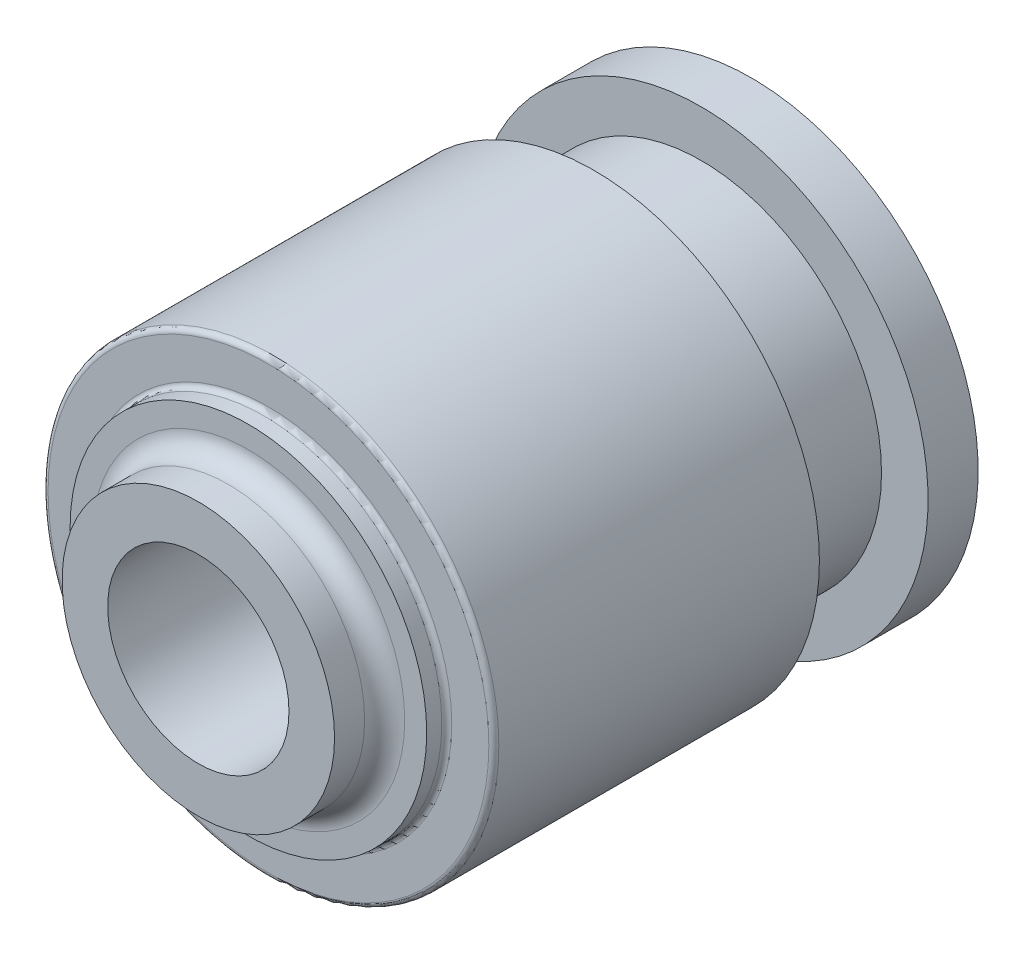
ISO-10303-21;
HEADER;
FILE_DESCRIPTION(('STEP AP214'),'2;1');
FILE_NAME('part.step','',(''),(''),'','','');
FILE_SCHEMA(('AUTOMOTIVE_DESIGN { 1 0 10303 214 1 1 1 1 }'));
ENDSEC;
DATA;
#1=APPLICATION_CONTEXT('core data for automotive mechanical design processes');
#2=APPLICATION_PROTOCOL_DEFINITION('international standard','automotive_design',2000,#1);
#3=PRODUCT_CONTEXT('',#1,'mechanical');
#4=PRODUCT('Part','Part','',(#3));
#5=PRODUCT_RELATED_PRODUCT_CATEGORY('part','',(#4));
#6=PRODUCT_DEFINITION_FORMATION('','',#4);
#7=PRODUCT_DEFINITION_CONTEXT('part definition',#1,'design');
#8=PRODUCT_DEFINITION('design','',#6,#7);
#9=PRODUCT_DEFINITION_SHAPE('','',#8);
#10=(LENGTH_UNIT() NAMED_UNIT(*) SI_UNIT(.MILLI.,.METRE.));
#11=(NAMED_UNIT(*) PLANE_ANGLE_UNIT() SI_UNIT($,.RADIAN.));
#12=(NAMED_UNIT(*) SI_UNIT($,.STERADIAN.) SOLID_ANGLE_UNIT());
#13=UNCERTAINTY_MEASURE_WITH_UNIT(LENGTH_MEASURE(1.E-05),#10,'distance_accuracy_value','');
#14=(GEOMETRIC_REPRESENTATION_CONTEXT(3) GLOBAL_UNCERTAINTY_ASSIGNED_CONTEXT((#13)) GLOBAL_UNIT_ASSIGNED_CONTEXT((#10,
#11,#12)) REPRESENTATION_CONTEXT('',''));
#15=CARTESIAN_POINT('',(0.,0.,0.));
#16=DIRECTION('',(0.,0.,1.));
#17=DIRECTION('',(1.,0.,0.));
#18=AXIS2_PLACEMENT_3D('',#15,#16,#17);
#19=CARTESIAN_POINT('',(0.,0.,-15.7));
#20=DIRECTION('',(0.,0.,-1.));
#21=DIRECTION('',(-1.,0.,0.));
#22=AXIS2_PLACEMENT_3D('',#19,#20,#21);
#23=PLANE('',#22);
#24=CARTESIAN_POINT('',(0.,0.,-15.7));
#25=DIRECTION('',(0.,0.,-1.));
#26=DIRECTION('',(-1.,0.,0.));
#27=AXIS2_PLACEMENT_3D('',#24,#25,#26);
#28=CIRCLE('',#27,22.65);
#29=CARTESIAN_POINT('',(-22.65,0.,-15.7));
#30=VERTEX_POINT('',#29);
#31=EDGE_CURVE('E202',#30,#30,#28,.T.);
#32=ORIENTED_EDGE('',*,*,#31,.T.);
#33=EDGE_LOOP('',(#32));
#34=FACE_BOUND('',#33,.T.);
#35=DIRECTION('',(1.,0.,0.));
#36=VECTOR('',#35,1.);
#37=CARTESIAN_POINT('',(8.,8.,-15.7));
#38=LINE('',#37,#36);
#39=CARTESIAN_POINT('',(-8.,8.,-15.7));
#40=VERTEX_POINT('',#39);
#41=CARTESIAN_POINT('',(8.,8.,-15.7));
#42=VERTEX_POINT('',#41);
#43=EDGE_CURVE('E181',#40,#42,#38,.T.);
#44=ORIENTED_EDGE('',*,*,#43,.F.);
#45=DIRECTION('',(0.,1.,0.));
#46=VECTOR('',#45,1.);
#47=CARTESIAN_POINT('',(-8.,-8.,-15.7));
#48=LINE('',#47,#46);
#49=CARTESIAN_POINT('',(-8.,-8.,-15.7));
#50=VERTEX_POINT('',#49);
#51=EDGE_CURVE('E131',#50,#40,#48,.T.);
#52=ORIENTED_EDGE('',*,*,#51,.F.);
#53=DIRECTION('',(-1.,0.,0.));
#54=VECTOR('',#53,1.);
#55=CARTESIAN_POINT('',(8.,-8.,-15.7));
#56=LINE('',#55,#54);
#57=CARTESIAN_POINT('',(8.,-8.,-15.7));
#58=VERTEX_POINT('',#57);
#59=EDGE_CURVE('E168',#58,#50,#56,.T.);
#60=ORIENTED_EDGE('',*,*,#59,.F.);
#61=DIRECTION('',(0.,-1.,0.));
#62=VECTOR('',#61,1.);
#63=CARTESIAN_POINT('',(8.,-8.,-15.7));
#64=LINE('',#63,#62);
#65=EDGE_CURVE('E184',#42,#58,#64,.T.);
#66=ORIENTED_EDGE('',*,*,#65,.F.);
#67=EDGE_LOOP('',(#44,#52,#60,#66));
#68=FACE_BOUND('',#67,.T.);
#69=ADVANCED_FACE('F43',(#34,#68),#23,.T.);
#70=CARTESIAN_POINT('',(0.,0.,32.5));
#71=DIRECTION('',(0.,0.,-1.));
#72=DIRECTION('',(-1.,0.,0.));
#73=AXIS2_PLACEMENT_3D('',#70,#71,#72);
#74=CYLINDRICAL_SURFACE('',#73,22.5);
#75=CARTESIAN_POINT('',(0.,0.,32.));
#76=DIRECTION('',(0.,0.,1.));
#77=DIRECTION('',(1.,0.,0.));
#78=AXIS2_PLACEMENT_3D('',#75,#76,#77);
#79=CIRCLE('',#78,22.5);
#80=CARTESIAN_POINT('',(22.5,0.,32.));
#81=VERTEX_POINT('',#80);
#82=EDGE_CURVE('E47',#81,#81,#79,.F.);
#83=ORIENTED_EDGE('',*,*,#82,.T.);
#84=EDGE_LOOP('',(#83));
#85=FACE_BOUND('',#84,.T.);
#86=CARTESIAN_POINT('',(0.,0.,0.));
#87=DIRECTION('',(0.,0.,1.));
#88=DIRECTION('',(1.,0.,0.));
#89=AXIS2_PLACEMENT_3D('',#86,#87,#88);
#90=CIRCLE('',#89,22.5);
#91=CARTESIAN_POINT('',(22.5,0.,0.));
#92=VERTEX_POINT('',#91);
#93=EDGE_CURVE('E229',#92,#92,#90,.T.);
#94=ORIENTED_EDGE('',*,*,#93,.T.);
#95=EDGE_LOOP('',(#94));
#96=FACE_BOUND('',#95,.T.);
#97=ADVANCED_FACE('F257',(#85,#96),#74,.T.);
#98=CARTESIAN_POINT('',(0.,0.,32.5));
#99=DIRECTION('',(0.,0.,1.));
#100=DIRECTION('',(1.,0.,0.));
#101=AXIS2_PLACEMENT_3D('',#98,#99,#100);
#102=PLANE('',#101);
#103=CARTESIAN_POINT('',(0.,0.,32.5));
#104=DIRECTION('',(0.,0.,1.));
#105=DIRECTION('',(1.,0.,0.));
#106=AXIS2_PLACEMENT_3D('',#103,#104,#105);
#107=CIRCLE('',#106,22.);
#108=CARTESIAN_POINT('',(22.,0.,32.5));
#109=VERTEX_POINT('',#108);
#110=EDGE_CURVE('E248',#109,#109,#107,.T.);
#111=ORIENTED_EDGE('',*,*,#110,.T.);
#112=EDGE_LOOP('',(#111));
#113=FACE_BOUND('',#112,.T.);
#114=CARTESIAN_POINT('',(0.,0.,32.5));
#115=DIRECTION('',(0.,0.,1.));
#116=DIRECTION('',(1.,0.,0.));
#117=AXIS2_PLACEMENT_3D('',#114,#115,#116);
#118=CIRCLE('',#117,18.3);
#119=CARTESIAN_POINT('',(18.3,0.,32.5));
#120=VERTEX_POINT('',#119);
#121=EDGE_CURVE('E237',#120,#120,#118,.F.);
#122=ORIENTED_EDGE('',*,*,#121,.T.);
#123=EDGE_LOOP('',(#122));
#124=FACE_BOUND('',#123,.T.);
#125=ADVANCED_FACE('F283',(#113,#124),#102,.T.);
#126=CARTESIAN_POINT('',(0.,0.,0.));
#127=DIRECTION('',(0.,0.,1.));
#128=DIRECTION('',(1.,0.,0.));
#129=AXIS2_PLACEMENT_3D('',#126,#127,#128);
#130=PLANE('',#129);
#131=CARTESIAN_POINT('',(0.,0.,0.));
#132=DIRECTION('',(0.,0.,-1.));
#133=DIRECTION('',(-1.,0.,0.));
#134=AXIS2_PLACEMENT_3D('',#131,#132,#133);
#135=CIRCLE('',#134,18.);
#136=CARTESIAN_POINT('',(-18.,0.,0.));
#137=VERTEX_POINT('',#136);
#138=EDGE_CURVE('E11',#137,#137,#135,.T.);
#139=ORIENTED_EDGE('',*,*,#138,.F.);
#140=EDGE_LOOP('',(#139));
#141=FACE_BOUND('',#140,.T.);
#142=ORIENTED_EDGE('',*,*,#93,.F.);
#143=EDGE_LOOP('',(#142));
#144=FACE_BOUND('',#143,.T.);
#145=ADVANCED_FACE('F508',(#141,#144),#130,.F.);
#146=CARTESIAN_POINT('',(0.,0.,34.5));
#147=DIRECTION('',(0.,0.,-1.));
#148=DIRECTION('',(-1.,0.,0.));
#149=AXIS2_PLACEMENT_3D('',#146,#147,#148);
#150=CYLINDRICAL_SURFACE('',#149,17.8);
#151=CARTESIAN_POINT('',(0.,0.,33.));
#152=DIRECTION('',(0.,0.,1.));
#153=DIRECTION('',(1.,0.,0.));
#154=AXIS2_PLACEMENT_3D('',#151,#152,#153);
#155=CIRCLE('',#154,17.8);
#156=CARTESIAN_POINT('',(17.8,0.,33.));
#157=VERTEX_POINT('',#156);
#158=EDGE_CURVE('E233',#157,#157,#155,.T.);
#159=ORIENTED_EDGE('',*,*,#158,.T.);
#160=EDGE_LOOP('',(#159));
#161=FACE_BOUND('',#160,.T.);
#162=CARTESIAN_POINT('',(0.,0.,34.5));
#163=DIRECTION('',(0.,0.,1.));
#164=DIRECTION('',(1.,0.,0.));
#165=AXIS2_PLACEMENT_3D('',#162,#163,#164);
#166=CIRCLE('',#165,17.8);
#167=CARTESIAN_POINT('',(17.8,0.,34.5));
#168=VERTEX_POINT('',#167);
#169=EDGE_CURVE('E225',#168,#168,#166,.T.);
#170=ORIENTED_EDGE('',*,*,#169,.F.);
#171=EDGE_LOOP('',(#170));
#172=FACE_BOUND('',#171,.T.);
#173=ADVANCED_FACE('F498',(#161,#172),#150,.T.);
#174=CARTESIAN_POINT('',(0.,0.,34.5));
#175=DIRECTION('',(0.,0.,1.));
#176=DIRECTION('',(1.,0.,0.));
#177=AXIS2_PLACEMENT_3D('',#174,#175,#176);
#178=PLANE('',#177);
#179=CARTESIAN_POINT('',(0.,0.,34.5));
#180=DIRECTION('',(0.,0.,1.));
#181=DIRECTION('',(1.,0.,0.));
#182=AXIS2_PLACEMENT_3D('',#179,#180,#181);
#183=CIRCLE('',#182,15.6);
#184=CARTESIAN_POINT('',(15.6,0.,34.5));
#185=VERTEX_POINT('',#184);
#186=EDGE_CURVE('E245',#185,#185,#183,.F.);
#187=ORIENTED_EDGE('',*,*,#186,.T.);
#188=EDGE_LOOP('',(#187));
#189=FACE_BOUND('',#188,.T.);
#190=ORIENTED_EDGE('',*,*,#169,.T.);
#191=EDGE_LOOP('',(#190));
#192=FACE_BOUND('',#191,.T.);
#193=ADVANCED_FACE('F488',(#189,#192),#178,.T.);
#194=CARTESIAN_POINT('',(0.,0.,33.));
#195=DIRECTION('',(0.,0.,1.));
#196=DIRECTION('',(1.,0.,0.));
#197=AXIS2_PLACEMENT_3D('',#194,#195,#196);
#198=TOROIDAL_SURFACE('',#197,18.3,0.5);
#199=ORIENTED_EDGE('',*,*,#121,.F.);
#200=EDGE_LOOP('',(#199));
#201=FACE_BOUND('',#200,.T.);
#202=ORIENTED_EDGE('',*,*,#158,.F.);
#203=EDGE_LOOP('',(#202));
#204=FACE_BOUND('',#203,.T.);
#205=ADVANCED_FACE('F478',(#201,#204),#198,.F.);
#206=CARTESIAN_POINT('',(0.,0.,39.5));
#207=DIRECTION('',(0.,0.,-1.));
#208=DIRECTION('',(-1.,0.,0.));
#209=AXIS2_PLACEMENT_3D('',#206,#207,#208);
#210=CYLINDRICAL_SURFACE('',#209,13.6);
#211=CARTESIAN_POINT('',(0.,0.,36.5));
#212=DIRECTION('',(0.,0.,1.));
#213=DIRECTION('',(1.,0.,0.));
#214=AXIS2_PLACEMENT_3D('',#211,#212,#213);
#215=CIRCLE('',#214,13.6);
#216=CARTESIAN_POINT('',(13.6,0.,36.5));
#217=VERTEX_POINT('',#216);
#218=EDGE_CURVE('E241',#217,#217,#215,.T.);
#219=ORIENTED_EDGE('',*,*,#218,.T.);
#220=EDGE_LOOP('',(#219));
#221=FACE_BOUND('',#220,.T.);
#222=CARTESIAN_POINT('',(0.,0.,39.5));
#223=DIRECTION('',(0.,0.,1.));
#224=DIRECTION('',(1.,0.,0.));
#225=AXIS2_PLACEMENT_3D('',#222,#223,#224);
#226=CIRCLE('',#225,13.6);
#227=CARTESIAN_POINT('',(13.6,0.,39.5));
#228=VERTEX_POINT('',#227);
#229=EDGE_CURVE('E218',#228,#228,#226,.T.);
#230=ORIENTED_EDGE('',*,*,#229,.F.);
#231=EDGE_LOOP('',(#230));
#232=FACE_BOUND('',#231,.T.);
#233=ADVANCED_FACE('F468',(#221,#232),#210,.T.);
#234=CARTESIAN_POINT('',(0.,0.,39.5));
#235=DIRECTION('',(0.,0.,1.));
#236=DIRECTION('',(1.,0.,0.));
#237=AXIS2_PLACEMENT_3D('',#234,#235,#236);
#238=PLANE('',#237);
#239=CARTESIAN_POINT('',(0.,0.,39.5));
#240=DIRECTION('',(0.,0.,1.));
#241=DIRECTION('',(1.,0.,0.));
#242=AXIS2_PLACEMENT_3D('',#239,#240,#241);
#243=CIRCLE('',#242,9.05);
#244=CARTESIAN_POINT('',(9.05,0.,39.5));
#245=VERTEX_POINT('',#244);
#246=EDGE_CURVE('E212',#245,#245,#243,.T.);
#247=ORIENTED_EDGE('',*,*,#246,.F.);
#248=EDGE_LOOP('',(#247));
#249=FACE_BOUND('',#248,.T.);
#250=ORIENTED_EDGE('',*,*,#229,.T.);
#251=EDGE_LOOP('',(#250));
#252=FACE_BOUND('',#251,.T.);
#253=ADVANCED_FACE('F459',(#249,#252),#238,.T.);
#254=CARTESIAN_POINT('',(0.,0.,36.5));
#255=DIRECTION('',(0.,0.,1.));
#256=DIRECTION('',(1.,0.,0.));
#257=AXIS2_PLACEMENT_3D('',#254,#255,#256);
#258=TOROIDAL_SURFACE('',#257,15.6,2.);
#259=ORIENTED_EDGE('',*,*,#186,.F.);
#260=EDGE_LOOP('',(#259));
#261=FACE_BOUND('',#260,.T.);
#262=ORIENTED_EDGE('',*,*,#218,.F.);
#263=EDGE_LOOP('',(#262));
#264=FACE_BOUND('',#263,.T.);
#265=ADVANCED_FACE('F449',(#261,#264),#258,.F.);
#266=CARTESIAN_POINT('',(0.,0.,19.5));
#267=DIRECTION('',(0.,0.,1.));
#268=DIRECTION('',(1.,0.,0.));
#269=AXIS2_PLACEMENT_3D('',#266,#267,#268);
#270=CYLINDRICAL_SURFACE('',#269,9.05);
#271=CARTESIAN_POINT('',(0.,0.,19.5));
#272=DIRECTION('',(0.,0.,1.));
#273=DIRECTION('',(1.,0.,0.));
#274=AXIS2_PLACEMENT_3D('',#271,#272,#273);
#275=CIRCLE('',#274,9.05);
#276=CARTESIAN_POINT('',(9.05,0.,19.5));
#277=VERTEX_POINT('',#276);
#278=EDGE_CURVE('E214',#277,#277,#275,.T.);
#279=ORIENTED_EDGE('',*,*,#278,.F.);
#280=EDGE_LOOP('',(#279));
#281=FACE_BOUND('',#280,.T.);
#282=ORIENTED_EDGE('',*,*,#246,.T.);
#283=EDGE_LOOP('',(#282));
#284=FACE_BOUND('',#283,.T.);
#285=ADVANCED_FACE('F271',(#281,#284),#270,.F.);
#286=CARTESIAN_POINT('',(0.,0.,19.5));
#287=DIRECTION('',(0.,0.,1.));
#288=DIRECTION('',(1.,0.,0.));
#289=AXIS2_PLACEMENT_3D('',#286,#287,#288);
#290=PLANE('',#289);
#291=ORIENTED_EDGE('',*,*,#278,.T.);
#292=EDGE_LOOP('',(#291));
#293=FACE_BOUND('',#292,.T.);
#294=ADVANCED_FACE('F263',(#293),#290,.T.);
#295=CARTESIAN_POINT('',(0.,0.,32.));
#296=DIRECTION('',(0.,0.,1.));
#297=DIRECTION('',(1.,0.,0.));
#298=AXIS2_PLACEMENT_3D('',#295,#296,#297);
#299=TOROIDAL_SURFACE('',#298,22.,0.5);
#300=ORIENTED_EDGE('',*,*,#82,.F.);
#301=EDGE_LOOP('',(#300));
#302=FACE_BOUND('',#301,.T.);
#303=ORIENTED_EDGE('',*,*,#110,.F.);
#304=EDGE_LOOP('',(#303));
#305=FACE_BOUND('',#304,.T.);
#306=ADVANCED_FACE('F45',(#302,#305),#299,.T.);
#307=CARTESIAN_POINT('',(0.,0.,-10.7));
#308=DIRECTION('',(0.,0.,1.));
#309=DIRECTION('',(1.,0.,0.));
#310=AXIS2_PLACEMENT_3D('',#307,#308,#309);
#311=CYLINDRICAL_SURFACE('',#310,18.);
#312=CARTESIAN_POINT('',(0.,0.,-10.7));
#313=DIRECTION('',(0.,0.,-1.));
#314=DIRECTION('',(-1.,0.,0.));
#315=AXIS2_PLACEMENT_3D('',#312,#313,#314);
#316=CIRCLE('',#315,18.);
#317=CARTESIAN_POINT('',(-18.,0.,-10.7));
#318=VERTEX_POINT('',#317);
#319=EDGE_CURVE('E206',#318,#318,#316,.T.);
#320=ORIENTED_EDGE('',*,*,#319,.F.);
#321=EDGE_LOOP('',(#320));
#322=FACE_BOUND('',#321,.T.);
#323=ORIENTED_EDGE('',*,*,#138,.T.);
#324=EDGE_LOOP('',(#323));
#325=FACE_BOUND('',#324,.T.);
#326=ADVANCED_FACE('F262',(#322,#325),#311,.T.);
#327=CARTESIAN_POINT('',(0.,0.,-15.7));
#328=DIRECTION('',(0.,0.,1.));
#329=DIRECTION('',(1.,0.,0.));
#330=AXIS2_PLACEMENT_3D('',#327,#328,#329);
#331=CYLINDRICAL_SURFACE('',#330,22.65);
#332=ORIENTED_EDGE('',*,*,#31,.F.);
#333=EDGE_LOOP('',(#332));
#334=FACE_BOUND('',#333,.T.);
#335=CARTESIAN_POINT('',(0.,0.,-10.7));
#336=DIRECTION('',(0.,0.,-1.));
#337=DIRECTION('',(-1.,0.,0.));
#338=AXIS2_PLACEMENT_3D('',#335,#336,#337);
#339=CIRCLE('',#338,22.65);
#340=CARTESIAN_POINT('',(-22.65,0.,-10.7));
#341=VERTEX_POINT('',#340);
#342=EDGE_CURVE('E201',#341,#341,#339,.T.);
#343=ORIENTED_EDGE('',*,*,#342,.T.);
#344=EDGE_LOOP('',(#343));
#345=FACE_BOUND('',#344,.T.);
#346=ADVANCED_FACE('F268',(#334,#345),#331,.T.);
#347=CARTESIAN_POINT('',(0.,0.,-10.7));
#348=DIRECTION('',(0.,0.,-1.));
#349=DIRECTION('',(-1.,0.,0.));
#350=AXIS2_PLACEMENT_3D('',#347,#348,#349);
#351=PLANE('',#350);
#352=ORIENTED_EDGE('',*,*,#319,.T.);
#353=EDGE_LOOP('',(#352));
#354=FACE_BOUND('',#353,.T.);
#355=ORIENTED_EDGE('',*,*,#342,.F.);
#356=EDGE_LOOP('',(#355));
#357=FACE_BOUND('',#356,.T.);
#358=ADVANCED_FACE('F311',(#354,#357),#351,.F.);
#359=CARTESIAN_POINT('',(0.,0.,-19.7));
#360=DIRECTION('',(0.,0.,1.));
#361=DIRECTION('',(1.,0.,0.));
#362=AXIS2_PLACEMENT_3D('',#359,#360,#361);
#363=PLANE('',#362);
#364=DIRECTION('',(0.,1.,0.));
#365=VECTOR('',#364,1.);
#366=CARTESIAN_POINT('',(-8.,-8.,-19.7));
#367=LINE('',#366,#365);
#368=CARTESIAN_POINT('',(-8.,-8.,-19.7));
#369=VERTEX_POINT('',#368);
#370=CARTESIAN_POINT('',(-8.,8.,-19.7));
#371=VERTEX_POINT('',#370);
#372=EDGE_CURVE('E163',#369,#371,#367,.T.);
#373=ORIENTED_EDGE('',*,*,#372,.T.);
#374=DIRECTION('',(1.,0.,0.));
#375=VECTOR('',#374,1.);
#376=CARTESIAN_POINT('',(8.,8.,-19.7));
#377=LINE('',#376,#375);
#378=CARTESIAN_POINT('',(8.,8.,-19.7));
#379=VERTEX_POINT('',#378);
#380=EDGE_CURVE('E167',#371,#379,#377,.T.);
#381=ORIENTED_EDGE('',*,*,#380,.T.);
#382=DIRECTION('',(0.,-1.,0.));
#383=VECTOR('',#382,1.);
#384=CARTESIAN_POINT('',(8.,-8.,-19.7));
#385=LINE('',#384,#383);
#386=CARTESIAN_POINT('',(8.,-8.,-19.7));
#387=VERTEX_POINT('',#386);
#388=EDGE_CURVE('E171',#379,#387,#385,.T.);
#389=ORIENTED_EDGE('',*,*,#388,.T.);
#390=DIRECTION('',(-1.,0.,0.));
#391=VECTOR('',#390,1.);
#392=CARTESIAN_POINT('',(8.,-8.,-19.7));
#393=LINE('',#392,#391);
#394=EDGE_CURVE('E174',#387,#369,#393,.T.);
#395=ORIENTED_EDGE('',*,*,#394,.T.);
#396=EDGE_LOOP('',(#373,#381,#389,#395));
#397=FACE_BOUND('',#396,.T.);
#398=DIRECTION('',(-1.,0.,0.));
#399=VECTOR('',#398,1.);
#400=CARTESIAN_POINT('',(6.5,-6.5,-19.7));
#401=LINE('',#400,#399);
#402=CARTESIAN_POINT('',(6.5,-6.5,-19.7));
#403=VERTEX_POINT('',#402);
#404=CARTESIAN_POINT('',(-6.5,-6.5,-19.7));
#405=VERTEX_POINT('',#404);
#406=EDGE_CURVE('E112',#403,#405,#401,.T.);
#407=ORIENTED_EDGE('',*,*,#406,.F.);
#408=DIRECTION('',(0.,-1.,0.));
#409=VECTOR('',#408,1.);
#410=CARTESIAN_POINT('',(6.5,-6.5,-19.7));
#411=LINE('',#410,#409);
#412=CARTESIAN_POINT('',(6.5,6.5,-19.7));
#413=VERTEX_POINT('',#412);
#414=EDGE_CURVE('E141',#413,#403,#411,.T.);
#415=ORIENTED_EDGE('',*,*,#414,.F.);
#416=DIRECTION('',(1.,0.,0.));
#417=VECTOR('',#416,1.);
#418=CARTESIAN_POINT('',(6.5,6.5,-19.7));
#419=LINE('',#418,#417);
#420=CARTESIAN_POINT('',(-6.5,6.5,-19.7));
#421=VERTEX_POINT('',#420);
#422=EDGE_CURVE('E137',#421,#413,#419,.T.);
#423=ORIENTED_EDGE('',*,*,#422,.F.);
#424=DIRECTION('',(0.,1.,0.));
#425=VECTOR('',#424,1.);
#426=CARTESIAN_POINT('',(-6.5,-6.5,-19.7));
#427=LINE('',#426,#425);
#428=EDGE_CURVE('E122',#405,#421,#427,.T.);
#429=ORIENTED_EDGE('',*,*,#428,.F.);
#430=EDGE_LOOP('',(#407,#415,#423,#429));
#431=FACE_BOUND('',#430,.T.);
#432=ADVANCED_FACE('F135',(#397,#431),#363,.F.);
#433=CARTESIAN_POINT('',(-8.,-8.,-19.7));
#434=DIRECTION('',(1.,0.,0.));
#435=DIRECTION('',(0.,0.,-1.));
#436=AXIS2_PLACEMENT_3D('',#433,#434,#435);
#437=PLANE('',#436);
#438=ORIENTED_EDGE('',*,*,#51,.T.);
#439=DIRECTION('',(0.,0.,1.));
#440=VECTOR('',#439,1.);
#441=CARTESIAN_POINT('',(-8.,8.,-19.7));
#442=LINE('',#441,#440);
#443=EDGE_CURVE('E198',#371,#40,#442,.T.);
#444=ORIENTED_EDGE('',*,*,#443,.F.);
#445=ORIENTED_EDGE('',*,*,#372,.F.);
#446=DIRECTION('',(0.,0.,1.));
#447=VECTOR('',#446,1.);
#448=CARTESIAN_POINT('',(-8.,-8.,-19.7));
#449=LINE('',#448,#447);
#450=EDGE_CURVE('E177',#369,#50,#449,.T.);
#451=ORIENTED_EDGE('',*,*,#450,.T.);
#452=EDGE_LOOP('',(#438,#444,#445,#451));
#453=FACE_BOUND('',#452,.T.);
#454=ADVANCED_FACE('F310',(#453),#437,.F.);
#455=CARTESIAN_POINT('',(8.,8.,-19.7));
#456=DIRECTION('',(0.,-1.,0.));
#457=DIRECTION('',(0.,0.,-1.));
#458=AXIS2_PLACEMENT_3D('',#455,#456,#457);
#459=PLANE('',#458);
#460=ORIENTED_EDGE('',*,*,#43,.T.);
#461=DIRECTION('',(0.,0.,1.));
#462=VECTOR('',#461,1.);
#463=CARTESIAN_POINT('',(8.,8.,-19.7));
#464=LINE('',#463,#462);
#465=EDGE_CURVE('E194',#379,#42,#464,.T.);
#466=ORIENTED_EDGE('',*,*,#465,.F.);
#467=ORIENTED_EDGE('',*,*,#380,.F.);
#468=ORIENTED_EDGE('',*,*,#443,.T.);
#469=EDGE_LOOP('',(#460,#466,#467,#468));
#470=FACE_BOUND('',#469,.T.);
#471=ADVANCED_FACE('F318',(#470),#459,.F.);
#472=CARTESIAN_POINT('',(8.,-8.,-19.7));
#473=DIRECTION('',(-1.,0.,0.));
#474=DIRECTION('',(0.,0.,1.));
#475=AXIS2_PLACEMENT_3D('',#472,#473,#474);
#476=PLANE('',#475);
#477=ORIENTED_EDGE('',*,*,#65,.T.);
#478=DIRECTION('',(0.,0.,1.));
#479=VECTOR('',#478,1.);
#480=CARTESIAN_POINT('',(8.,-8.,-19.7));
#481=LINE('',#480,#479);
#482=EDGE_CURVE('E60',#387,#58,#481,.T.);
#483=ORIENTED_EDGE('',*,*,#482,.F.);
#484=ORIENTED_EDGE('',*,*,#388,.F.);
#485=ORIENTED_EDGE('',*,*,#465,.T.);
#486=EDGE_LOOP('',(#477,#483,#484,#485));
#487=FACE_BOUND('',#486,.T.);
#488=ADVANCED_FACE('F315',(#487),#476,.F.);
#489=CARTESIAN_POINT('',(8.,-8.,-19.7));
#490=DIRECTION('',(0.,1.,0.));
#491=DIRECTION('',(0.,0.,1.));
#492=AXIS2_PLACEMENT_3D('',#489,#490,#491);
#493=PLANE('',#492);
#494=ORIENTED_EDGE('',*,*,#59,.T.);
#495=ORIENTED_EDGE('',*,*,#450,.F.);
#496=ORIENTED_EDGE('',*,*,#394,.F.);
#497=ORIENTED_EDGE('',*,*,#482,.T.);
#498=EDGE_LOOP('',(#494,#495,#496,#497));
#499=FACE_BOUND('',#498,.T.);
#500=ADVANCED_FACE('F307',(#499),#493,.F.);
#501=CARTESIAN_POINT('',(6.5,-6.5,-19.7));
#502=DIRECTION('',(0.,1.,0.));
#503=DIRECTION('',(0.,0.,1.));
#504=AXIS2_PLACEMENT_3D('',#501,#502,#503);
#505=PLANE('',#504);
#506=DIRECTION('',(-1.,0.,0.));
#507=VECTOR('',#506,1.);
#508=CARTESIAN_POINT('',(6.5,-6.5,-15.7));
#509=LINE('',#508,#507);
#510=CARTESIAN_POINT('',(6.5,-6.5,-15.7));
#511=VERTEX_POINT('',#510);
#512=CARTESIAN_POINT('',(-6.5,-6.5,-15.7));
#513=VERTEX_POINT('',#512);
#514=EDGE_CURVE('E68',#511,#513,#509,.T.);
#515=ORIENTED_EDGE('',*,*,#514,.F.);
#516=DIRECTION('',(0.,0.,1.));
#517=VECTOR('',#516,1.);
#518=CARTESIAN_POINT('',(6.5,-6.5,-19.7));
#519=LINE('',#518,#517);
#520=EDGE_CURVE('E117',#403,#511,#519,.T.);
#521=ORIENTED_EDGE('',*,*,#520,.F.);
#522=ORIENTED_EDGE('',*,*,#406,.T.);
#523=DIRECTION('',(0.,0.,1.));
#524=VECTOR('',#523,1.);
#525=CARTESIAN_POINT('',(-6.5,-6.5,-19.7));
#526=LINE('',#525,#524);
#527=EDGE_CURVE('E115',#405,#513,#526,.T.);
#528=ORIENTED_EDGE('',*,*,#527,.T.);
#529=EDGE_LOOP('',(#515,#521,#522,#528));
#530=FACE_BOUND('',#529,.T.);
#531=ADVANCED_FACE('F114',(#530),#505,.T.);
#532=CARTESIAN_POINT('',(-6.5,-6.5,-19.7));
#533=DIRECTION('',(1.,0.,0.));
#534=DIRECTION('',(0.,1.,0.));
#535=AXIS2_PLACEMENT_3D('',#532,#533,#534);
#536=PLANE('',#535);
#537=DIRECTION('',(0.,1.,0.));
#538=VECTOR('',#537,1.);
#539=CARTESIAN_POINT('',(-6.5,-6.5,-15.7));
#540=LINE('',#539,#538);
#541=CARTESIAN_POINT('',(-6.5,6.5,-15.7));
#542=VERTEX_POINT('',#541);
#543=EDGE_CURVE('E129',#513,#542,#540,.T.);
#544=ORIENTED_EDGE('',*,*,#543,.F.);
#545=ORIENTED_EDGE('',*,*,#527,.F.);
#546=ORIENTED_EDGE('',*,*,#428,.T.);
#547=DIRECTION('',(0.,0.,1.));
#548=VECTOR('',#547,1.);
#549=CARTESIAN_POINT('',(-6.5,6.5,-19.7));
#550=LINE('',#549,#548);
#551=EDGE_CURVE('E132',#421,#542,#550,.T.);
#552=ORIENTED_EDGE('',*,*,#551,.T.);
#553=EDGE_LOOP('',(#544,#545,#546,#552));
#554=FACE_BOUND('',#553,.T.);
#555=ADVANCED_FACE('F126',(#554),#536,.T.);
#556=CARTESIAN_POINT('',(6.5,6.5,-19.7));
#557=DIRECTION('',(0.,-1.,0.));
#558=DIRECTION('',(0.,0.,-1.));
#559=AXIS2_PLACEMENT_3D('',#556,#557,#558);
#560=PLANE('',#559);
#561=DIRECTION('',(1.,0.,0.));
#562=VECTOR('',#561,1.);
#563=CARTESIAN_POINT('',(6.5,6.5,-15.7));
#564=LINE('',#563,#562);
#565=CARTESIAN_POINT('',(6.5,6.5,-15.7));
#566=VERTEX_POINT('',#565);
#567=EDGE_CURVE('E150',#542,#566,#564,.T.);
#568=ORIENTED_EDGE('',*,*,#567,.F.);
#569=ORIENTED_EDGE('',*,*,#551,.F.);
#570=ORIENTED_EDGE('',*,*,#422,.T.);
#571=DIRECTION('',(0.,0.,1.));
#572=VECTOR('',#571,1.);
#573=CARTESIAN_POINT('',(6.5,6.5,-19.7));
#574=LINE('',#573,#572);
#575=EDGE_CURVE('E157',#413,#566,#574,.T.);
#576=ORIENTED_EDGE('',*,*,#575,.T.);
#577=EDGE_LOOP('',(#568,#569,#570,#576));
#578=FACE_BOUND('',#577,.T.);
#579=ADVANCED_FACE('F294',(#578),#560,.T.);
#580=CARTESIAN_POINT('',(6.5,-6.5,-19.7));
#581=DIRECTION('',(-1.,0.,0.));
#582=DIRECTION('',(0.,0.,1.));
#583=AXIS2_PLACEMENT_3D('',#580,#581,#582);
#584=PLANE('',#583);
#585=DIRECTION('',(0.,-1.,0.));
#586=VECTOR('',#585,1.);
#587=CARTESIAN_POINT('',(6.5,-6.5,-15.7));
#588=LINE('',#587,#586);
#589=EDGE_CURVE('E123',#566,#511,#588,.T.);
#590=ORIENTED_EDGE('',*,*,#589,.F.);
#591=ORIENTED_EDGE('',*,*,#575,.F.);
#592=ORIENTED_EDGE('',*,*,#414,.T.);
#593=ORIENTED_EDGE('',*,*,#520,.T.);
#594=EDGE_LOOP('',(#590,#591,#592,#593));
#595=FACE_BOUND('',#594,.T.);
#596=ADVANCED_FACE('F289',(#595),#584,.T.);
#597=ORIENTED_EDGE('',*,*,#514,.T.);
#598=ORIENTED_EDGE('',*,*,#543,.T.);
#599=ORIENTED_EDGE('',*,*,#567,.T.);
#600=ORIENTED_EDGE('',*,*,#589,.T.);
#601=EDGE_LOOP('',(#597,#598,#599,#600));
#602=FACE_BOUND('',#601,.T.);
#603=ADVANCED_FACE('F277',(#602),#23,.T.);
#604=CLOSED_SHELL('',(#69,#97,#125,#145,#173,#193,#205,#233,#253,#265,#285,#294,#306,#326,#346,
#358,#432,#454,#471,#488,#500,#531,#555,#579,#596,#603));
#605=MANIFOLD_SOLID_BREP('B2',#604);
#606=ADVANCED_BREP_SHAPE_REPRESENTATION('',(#18,#605),#14);
#607=SHAPE_DEFINITION_REPRESENTATION(#9,#606);
ENDSEC;
END-ISO-10303-21;
